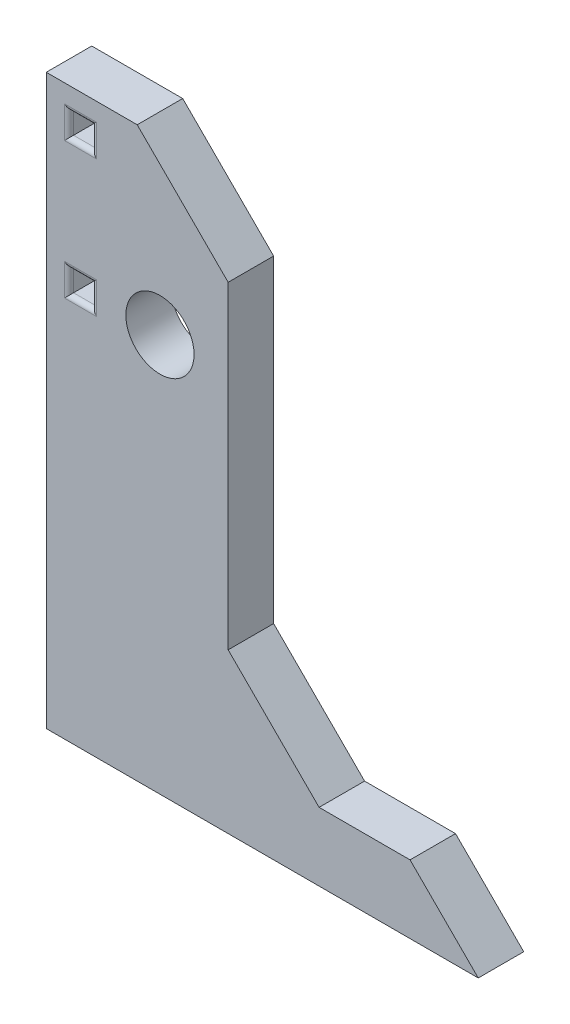
ISO-10303-21;
HEADER;
FILE_DESCRIPTION(('STEP AP214'),'2;1');
FILE_NAME('part.step','',(''),(''),'','','');
FILE_SCHEMA(('AUTOMOTIVE_DESIGN { 1 0 10303 214 1 1 1 1 }'));
ENDSEC;
DATA;
#1=APPLICATION_CONTEXT('core data for automotive mechanical design processes');
#2=APPLICATION_PROTOCOL_DEFINITION('international standard','automotive_design',2000,#1);
#3=PRODUCT_CONTEXT('',#1,'mechanical');
#4=PRODUCT('Part','Part','',(#3));
#5=PRODUCT_RELATED_PRODUCT_CATEGORY('part','',(#4));
#6=PRODUCT_DEFINITION_FORMATION('','',#4);
#7=PRODUCT_DEFINITION_CONTEXT('part definition',#1,'design');
#8=PRODUCT_DEFINITION('design','',#6,#7);
#9=PRODUCT_DEFINITION_SHAPE('','',#8);
#10=(LENGTH_UNIT() NAMED_UNIT(*) SI_UNIT(.MILLI.,.METRE.));
#11=(NAMED_UNIT(*) PLANE_ANGLE_UNIT() SI_UNIT($,.RADIAN.));
#12=(NAMED_UNIT(*) SI_UNIT($,.STERADIAN.) SOLID_ANGLE_UNIT());
#13=UNCERTAINTY_MEASURE_WITH_UNIT(LENGTH_MEASURE(1.E-05),#10,'distance_accuracy_value','');
#14=(GEOMETRIC_REPRESENTATION_CONTEXT(3) GLOBAL_UNCERTAINTY_ASSIGNED_CONTEXT((#13)) GLOBAL_UNIT_ASSIGNED_CONTEXT((#10,
#11,#12)) REPRESENTATION_CONTEXT('',''));
#15=CARTESIAN_POINT('',(0.,0.,0.));
#16=DIRECTION('',(0.,0.,1.));
#17=DIRECTION('',(1.,0.,0.));
#18=AXIS2_PLACEMENT_3D('',#15,#16,#17);
#19=CARTESIAN_POINT('',(-80.,0.,20.));
#20=DIRECTION('',(-1.,0.,0.));
#21=DIRECTION('',(0.,-1.,0.));
#22=AXIS2_PLACEMENT_3D('',#19,#20,#21);
#23=PLANE('',#22);
#24=DIRECTION('',(0.,1.,0.));
#25=VECTOR('',#24,1.);
#26=CARTESIAN_POINT('',(-80.,0.,0.));
#27=LINE('',#26,#25);
#28=CARTESIAN_POINT('',(-80.,-175.,0.));
#29=VERTEX_POINT('',#28);
#30=CARTESIAN_POINT('',(-80.,75.,0.));
#31=VERTEX_POINT('',#30);
#32=EDGE_CURVE('E240',#29,#31,#27,.T.);
#33=ORIENTED_EDGE('',*,*,#32,.F.);
#34=DIRECTION('',(0.,0.,-1.));
#35=VECTOR('',#34,1.);
#36=CARTESIAN_POINT('',(-80.,-175.,20.));
#37=LINE('',#36,#35);
#38=CARTESIAN_POINT('',(-80.,-175.,20.));
#39=VERTEX_POINT('',#38);
#40=EDGE_CURVE('E226',#39,#29,#37,.T.);
#41=ORIENTED_EDGE('',*,*,#40,.F.);
#42=DIRECTION('',(0.,1.,0.));
#43=VECTOR('',#42,1.);
#44=CARTESIAN_POINT('',(-80.,0.,20.));
#45=LINE('',#44,#43);
#46=CARTESIAN_POINT('',(-80.,75.,20.));
#47=VERTEX_POINT('',#46);
#48=EDGE_CURVE('E234',#39,#47,#45,.T.);
#49=ORIENTED_EDGE('',*,*,#48,.T.);
#50=DIRECTION('',(0.,0.,-1.));
#51=VECTOR('',#50,1.);
#52=CARTESIAN_POINT('',(-80.,75.,20.));
#53=LINE('',#52,#51);
#54=EDGE_CURVE('E242',#47,#31,#53,.T.);
#55=ORIENTED_EDGE('',*,*,#54,.T.);
#56=EDGE_LOOP('',(#33,#41,#49,#55));
#57=FACE_BOUND('',#56,.T.);
#58=ADVANCED_FACE('F47',(#57),#23,.T.);
#59=CARTESIAN_POINT('',(0.,-175.,20.));
#60=DIRECTION('',(0.,-1.,0.));
#61=DIRECTION('',(1.,0.,0.));
#62=AXIS2_PLACEMENT_3D('',#59,#60,#61);
#63=PLANE('',#62);
#64=DIRECTION('',(-1.,0.,0.));
#65=VECTOR('',#64,1.);
#66=CARTESIAN_POINT('',(0.,-175.,0.));
#67=LINE('',#66,#65);
#68=CARTESIAN_POINT('',(110.,-175.,0.));
#69=VERTEX_POINT('',#68);
#70=EDGE_CURVE('E269',#69,#29,#67,.T.);
#71=ORIENTED_EDGE('',*,*,#70,.F.);
#72=DIRECTION('',(0.,0.,-1.));
#73=VECTOR('',#72,1.);
#74=CARTESIAN_POINT('',(110.,-175.,20.));
#75=LINE('',#74,#73);
#76=CARTESIAN_POINT('',(110.,-175.,20.));
#77=VERTEX_POINT('',#76);
#78=EDGE_CURVE('E229',#69,#77,#75,.F.);
#79=ORIENTED_EDGE('',*,*,#78,.T.);
#80=DIRECTION('',(-1.,0.,0.));
#81=VECTOR('',#80,1.);
#82=CARTESIAN_POINT('',(0.,-175.,20.));
#83=LINE('',#82,#81);
#84=EDGE_CURVE('E222',#77,#39,#83,.T.);
#85=ORIENTED_EDGE('',*,*,#84,.T.);
#86=ORIENTED_EDGE('',*,*,#40,.T.);
#87=EDGE_LOOP('',(#71,#79,#85,#86));
#88=FACE_BOUND('',#87,.T.);
#89=ADVANCED_FACE('F225',(#88),#63,.T.);
#90=CARTESIAN_POINT('',(0.,-145.,20.));
#91=DIRECTION('',(0.,1.,0.));
#92=DIRECTION('',(0.,0.,1.));
#93=AXIS2_PLACEMENT_3D('',#90,#91,#92);
#94=PLANE('',#93);
#95=DIRECTION('',(1.,0.,0.));
#96=VECTOR('',#95,1.);
#97=CARTESIAN_POINT('',(0.,-145.,20.));
#98=LINE('',#97,#96);
#99=CARTESIAN_POINT('',(39.9999999999999,-145.,20.));
#100=VERTEX_POINT('',#99);
#101=CARTESIAN_POINT('',(79.9999999999993,-145.,20.));
#102=VERTEX_POINT('',#101);
#103=EDGE_CURVE('E233',#100,#102,#98,.T.);
#104=ORIENTED_EDGE('',*,*,#103,.T.);
#105=DIRECTION('',(0.,0.,-1.));
#106=VECTOR('',#105,1.);
#107=CARTESIAN_POINT('',(79.9999999999993,-145.,20.));
#108=LINE('',#107,#106);
#109=CARTESIAN_POINT('',(79.9999999999993,-145.,0.));
#110=VERTEX_POINT('',#109);
#111=EDGE_CURVE('E281',#102,#110,#108,.T.);
#112=ORIENTED_EDGE('',*,*,#111,.T.);
#113=DIRECTION('',(1.,0.,0.));
#114=VECTOR('',#113,1.);
#115=CARTESIAN_POINT('',(0.,-145.,0.));
#116=LINE('',#115,#114);
#117=CARTESIAN_POINT('',(39.9999999999999,-145.,0.));
#118=VERTEX_POINT('',#117);
#119=EDGE_CURVE('E271',#118,#110,#116,.T.);
#120=ORIENTED_EDGE('',*,*,#119,.F.);
#121=DIRECTION('',(0.,0.,1.));
#122=VECTOR('',#121,1.);
#123=CARTESIAN_POINT('',(39.9999999999999,-145.,20.));
#124=LINE('',#123,#122);
#125=EDGE_CURVE('E241',#118,#100,#124,.T.);
#126=ORIENTED_EDGE('',*,*,#125,.T.);
#127=EDGE_LOOP('',(#104,#112,#120,#126));
#128=FACE_BOUND('',#127,.T.);
#129=ADVANCED_FACE('F511',(#128),#94,.T.);
#130=CARTESIAN_POINT('',(0.,0.,20.));
#131=DIRECTION('',(1.,0.,0.));
#132=DIRECTION('',(0.,1.,0.));
#133=AXIS2_PLACEMENT_3D('',#130,#131,#132);
#134=PLANE('',#133);
#135=DIRECTION('',(0.,-1.,0.));
#136=VECTOR('',#135,1.);
#137=CARTESIAN_POINT('',(0.,0.,0.));
#138=LINE('',#137,#136);
#139=CARTESIAN_POINT('',(0.,34.9999999999999,0.));
#140=VERTEX_POINT('',#139);
#141=CARTESIAN_POINT('',(0.,-105.,0.));
#142=VERTEX_POINT('',#141);
#143=EDGE_CURVE('E274',#140,#142,#138,.T.);
#144=ORIENTED_EDGE('',*,*,#143,.F.);
#145=DIRECTION('',(0.,0.,1.));
#146=VECTOR('',#145,1.);
#147=CARTESIAN_POINT('',(0.,34.9999999999999,20.));
#148=LINE('',#147,#146);
#149=CARTESIAN_POINT('',(0.,34.9999999999999,20.));
#150=VERTEX_POINT('',#149);
#151=EDGE_CURVE('E299',#140,#150,#148,.T.);
#152=ORIENTED_EDGE('',*,*,#151,.T.);
#153=DIRECTION('',(0.,-1.,0.));
#154=VECTOR('',#153,1.);
#155=CARTESIAN_POINT('',(0.,0.,20.));
#156=LINE('',#155,#154);
#157=CARTESIAN_POINT('',(0.,-105.,20.));
#158=VERTEX_POINT('',#157);
#159=EDGE_CURVE('E259',#150,#158,#156,.T.);
#160=ORIENTED_EDGE('',*,*,#159,.T.);
#161=DIRECTION('',(0.,0.,-1.));
#162=VECTOR('',#161,1.);
#163=CARTESIAN_POINT('',(0.,-105.,0.));
#164=LINE('',#163,#162);
#165=EDGE_CURVE('E296',#158,#142,#164,.T.);
#166=ORIENTED_EDGE('',*,*,#165,.T.);
#167=EDGE_LOOP('',(#144,#152,#160,#166));
#168=FACE_BOUND('',#167,.T.);
#169=ADVANCED_FACE('F519',(#168),#134,.T.);
#170=CARTESIAN_POINT('',(-30.,0.,20.));
#171=DIRECTION('',(0.,0.,-1.));
#172=DIRECTION('',(-1.,0.,0.));
#173=AXIS2_PLACEMENT_3D('',#170,#171,#172);
#174=CYLINDRICAL_SURFACE('',#173,15.);
#175=CARTESIAN_POINT('',(-30.,0.,20.));
#176=DIRECTION('',(0.,0.,1.));
#177=DIRECTION('',(1.,0.,0.));
#178=AXIS2_PLACEMENT_3D('',#175,#176,#177);
#179=CIRCLE('',#178,15.);
#180=CARTESIAN_POINT('',(-15.,0.,20.));
#181=VERTEX_POINT('',#180);
#182=EDGE_CURVE('E248',#181,#181,#179,.T.);
#183=ORIENTED_EDGE('',*,*,#182,.T.);
#184=EDGE_LOOP('',(#183));
#185=FACE_BOUND('',#184,.T.);
#186=CARTESIAN_POINT('',(-30.,0.,0.));
#187=DIRECTION('',(0.,0.,1.));
#188=DIRECTION('',(1.,0.,0.));
#189=AXIS2_PLACEMENT_3D('',#186,#187,#188);
#190=CIRCLE('',#189,15.);
#191=CARTESIAN_POINT('',(-15.,0.,0.));
#192=VERTEX_POINT('',#191);
#193=EDGE_CURVE('E263',#192,#192,#190,.T.);
#194=ORIENTED_EDGE('',*,*,#193,.F.);
#195=EDGE_LOOP('',(#194));
#196=FACE_BOUND('',#195,.T.);
#197=ADVANCED_FACE('F515',(#185,#196),#174,.F.);
#198=CARTESIAN_POINT('',(0.,75.,20.));
#199=DIRECTION('',(0.,1.,0.));
#200=DIRECTION('',(0.,0.,1.));
#201=AXIS2_PLACEMENT_3D('',#198,#199,#200);
#202=PLANE('',#201);
#203=DIRECTION('',(1.,0.,0.));
#204=VECTOR('',#203,1.);
#205=CARTESIAN_POINT('',(0.,75.,20.));
#206=LINE('',#205,#204);
#207=CARTESIAN_POINT('',(-40.,75.,20.));
#208=VERTEX_POINT('',#207);
#209=EDGE_CURVE('E246',#47,#208,#206,.T.);
#210=ORIENTED_EDGE('',*,*,#209,.T.);
#211=DIRECTION('',(0.,0.,-1.));
#212=VECTOR('',#211,1.);
#213=CARTESIAN_POINT('',(-40.,75.,20.));
#214=LINE('',#213,#212);
#215=CARTESIAN_POINT('',(-40.,75.,0.));
#216=VERTEX_POINT('',#215);
#217=EDGE_CURVE('E293',#208,#216,#214,.T.);
#218=ORIENTED_EDGE('',*,*,#217,.T.);
#219=DIRECTION('',(1.,0.,0.));
#220=VECTOR('',#219,1.);
#221=CARTESIAN_POINT('',(0.,75.,0.));
#222=LINE('',#221,#220);
#223=EDGE_CURVE('E253',#31,#216,#222,.T.);
#224=ORIENTED_EDGE('',*,*,#223,.F.);
#225=ORIENTED_EDGE('',*,*,#54,.F.);
#226=EDGE_LOOP('',(#210,#218,#224,#225));
#227=FACE_BOUND('',#226,.T.);
#228=ADVANCED_FACE('F518',(#227),#202,.T.);
#229=CARTESIAN_POINT('',(0.,0.,20.));
#230=DIRECTION('',(0.,0.,1.));
#231=DIRECTION('',(1.,0.,0.));
#232=AXIS2_PLACEMENT_3D('',#229,#230,#231);
#233=PLANE('',#232);
#234=DIRECTION('',(1.,0.,0.));
#235=VECTOR('',#234,1.);
#236=CARTESIAN_POINT('',(-70.,53.,20.));
#237=LINE('',#236,#235);
#238=CARTESIAN_POINT('',(-58.,53.,20.));
#239=VERTEX_POINT('',#238);
#240=CARTESIAN_POINT('',(-72.,53.,20.));
#241=VERTEX_POINT('',#240);
#242=EDGE_CURVE('E325',#239,#241,#237,.F.);
#243=ORIENTED_EDGE('',*,*,#242,.T.);
#244=DIRECTION('',(0.,-1.,0.));
#245=VECTOR('',#244,1.);
#246=CARTESIAN_POINT('',(-72.,65.,20.));
#247=LINE('',#246,#245);
#248=CARTESIAN_POINT('',(-72.,67.,20.));
#249=VERTEX_POINT('',#248);
#250=EDGE_CURVE('E331',#241,#249,#247,.F.);
#251=ORIENTED_EDGE('',*,*,#250,.T.);
#252=DIRECTION('',(-1.,0.,0.));
#253=VECTOR('',#252,1.);
#254=CARTESIAN_POINT('',(-60.,67.,20.));
#255=LINE('',#254,#253);
#256=CARTESIAN_POINT('',(-58.,67.,20.));
#257=VERTEX_POINT('',#256);
#258=EDGE_CURVE('E329',#249,#257,#255,.F.);
#259=ORIENTED_EDGE('',*,*,#258,.T.);
#260=DIRECTION('',(0.,1.,0.));
#261=VECTOR('',#260,1.);
#262=CARTESIAN_POINT('',(-58.,55.,20.));
#263=LINE('',#262,#261);
#264=EDGE_CURVE('E327',#257,#239,#263,.F.);
#265=ORIENTED_EDGE('',*,*,#264,.T.);
#266=EDGE_LOOP('',(#243,#251,#259,#265));
#267=FACE_BOUND('',#266,.T.);
#268=DIRECTION('',(1.,0.,0.));
#269=VECTOR('',#268,1.);
#270=CARTESIAN_POINT('',(-70.,-7.,20.));
#271=LINE('',#270,#269);
#272=CARTESIAN_POINT('',(-58.,-7.,20.));
#273=VERTEX_POINT('',#272);
#274=CARTESIAN_POINT('',(-72.,-7.,20.));
#275=VERTEX_POINT('',#274);
#276=EDGE_CURVE('E318',#273,#275,#271,.F.);
#277=ORIENTED_EDGE('',*,*,#276,.T.);
#278=DIRECTION('',(0.,-1.,0.));
#279=VECTOR('',#278,1.);
#280=CARTESIAN_POINT('',(-72.,5.,20.));
#281=LINE('',#280,#279);
#282=CARTESIAN_POINT('',(-72.,7.,20.));
#283=VERTEX_POINT('',#282);
#284=EDGE_CURVE('E321',#275,#283,#281,.F.);
#285=ORIENTED_EDGE('',*,*,#284,.T.);
#286=DIRECTION('',(-1.,0.,0.));
#287=VECTOR('',#286,1.);
#288=CARTESIAN_POINT('',(-60.,7.,20.));
#289=LINE('',#288,#287);
#290=CARTESIAN_POINT('',(-58.,7.,20.));
#291=VERTEX_POINT('',#290);
#292=EDGE_CURVE('E315',#283,#291,#289,.F.);
#293=ORIENTED_EDGE('',*,*,#292,.T.);
#294=DIRECTION('',(0.,1.,0.));
#295=VECTOR('',#294,1.);
#296=CARTESIAN_POINT('',(-58.,-5.,20.));
#297=LINE('',#296,#295);
#298=EDGE_CURVE('E312',#291,#273,#297,.F.);
#299=ORIENTED_EDGE('',*,*,#298,.T.);
#300=EDGE_LOOP('',(#277,#285,#293,#299));
#301=FACE_BOUND('',#300,.T.);
#302=ORIENTED_EDGE('',*,*,#182,.F.);
#303=EDGE_LOOP('',(#302));
#304=FACE_BOUND('',#303,.T.);
#305=ORIENTED_EDGE('',*,*,#84,.F.);
#306=DIRECTION('',(0.707106781186552,-0.707106781186543,0.));
#307=VECTOR('',#306,1.);
#308=CARTESIAN_POINT('',(-32.5000000000008,-32.5000000000012,20.));
#309=LINE('',#308,#307);
#310=EDGE_CURVE('E291',#77,#102,#309,.F.);
#311=ORIENTED_EDGE('',*,*,#310,.T.);
#312=ORIENTED_EDGE('',*,*,#103,.F.);
#313=DIRECTION('',(0.707106781186544,-0.707106781186551,0.));
#314=VECTOR('',#313,1.);
#315=CARTESIAN_POINT('',(0.,-105.,20.));
#316=LINE('',#315,#314);
#317=EDGE_CURVE('E304',#100,#158,#316,.F.);
#318=ORIENTED_EDGE('',*,*,#317,.T.);
#319=ORIENTED_EDGE('',*,*,#159,.F.);
#320=DIRECTION('',(0.707106781186546,-0.707106781186549,0.));
#321=VECTOR('',#320,1.);
#322=CARTESIAN_POINT('',(17.5,17.4999999999999,20.));
#323=LINE('',#322,#321);
#324=EDGE_CURVE('E289',#150,#208,#323,.F.);
#325=ORIENTED_EDGE('',*,*,#324,.T.);
#326=ORIENTED_EDGE('',*,*,#209,.F.);
#327=ORIENTED_EDGE('',*,*,#48,.F.);
#328=EDGE_LOOP('',(#305,#311,#312,#318,#319,#325,#326,#327));
#329=FACE_BOUND('',#328,.T.);
#330=ADVANCED_FACE('F244',(#267,#301,#304,#329),#233,.T.);
#331=CARTESIAN_POINT('',(0.,0.,0.));
#332=DIRECTION('',(0.,0.,1.));
#333=DIRECTION('',(1.,0.,0.));
#334=AXIS2_PLACEMENT_3D('',#331,#332,#333);
#335=PLANE('',#334);
#336=DIRECTION('',(-1.,0.,0.));
#337=VECTOR('',#336,1.);
#338=CARTESIAN_POINT('',(0.,67.,0.));
#339=LINE('',#338,#337);
#340=CARTESIAN_POINT('',(-58.,67.,0.));
#341=VERTEX_POINT('',#340);
#342=CARTESIAN_POINT('',(-72.,67.,0.));
#343=VERTEX_POINT('',#342);
#344=EDGE_CURVE('E56',#341,#343,#339,.T.);
#345=ORIENTED_EDGE('',*,*,#344,.T.);
#346=DIRECTION('',(0.,-1.,0.));
#347=VECTOR('',#346,1.);
#348=CARTESIAN_POINT('',(-72.,0.,0.));
#349=LINE('',#348,#347);
#350=CARTESIAN_POINT('',(-72.,53.,0.));
#351=VERTEX_POINT('',#350);
#352=EDGE_CURVE('E11',#343,#351,#349,.T.);
#353=ORIENTED_EDGE('',*,*,#352,.T.);
#354=DIRECTION('',(1.,0.,0.));
#355=VECTOR('',#354,1.);
#356=CARTESIAN_POINT('',(0.,53.,0.));
#357=LINE('',#356,#355);
#358=CARTESIAN_POINT('',(-58.,53.,0.));
#359=VERTEX_POINT('',#358);
#360=EDGE_CURVE('E385',#351,#359,#357,.T.);
#361=ORIENTED_EDGE('',*,*,#360,.T.);
#362=DIRECTION('',(0.,1.,0.));
#363=VECTOR('',#362,1.);
#364=CARTESIAN_POINT('',(-58.,0.,0.));
#365=LINE('',#364,#363);
#366=EDGE_CURVE('E67',#359,#341,#365,.T.);
#367=ORIENTED_EDGE('',*,*,#366,.T.);
#368=EDGE_LOOP('',(#345,#353,#361,#367));
#369=FACE_BOUND('',#368,.T.);
#370=DIRECTION('',(0.,1.,0.));
#371=VECTOR('',#370,1.);
#372=CARTESIAN_POINT('',(-58.,0.,0.));
#373=LINE('',#372,#371);
#374=CARTESIAN_POINT('',(-58.,-7.,0.));
#375=VERTEX_POINT('',#374);
#376=CARTESIAN_POINT('',(-58.,7.,0.));
#377=VERTEX_POINT('',#376);
#378=EDGE_CURVE('E375',#375,#377,#373,.T.);
#379=ORIENTED_EDGE('',*,*,#378,.T.);
#380=DIRECTION('',(-1.,0.,0.));
#381=VECTOR('',#380,1.);
#382=CARTESIAN_POINT('',(0.,7.,0.));
#383=LINE('',#382,#381);
#384=CARTESIAN_POINT('',(-72.,7.,0.));
#385=VERTEX_POINT('',#384);
#386=EDGE_CURVE('E382',#377,#385,#383,.T.);
#387=ORIENTED_EDGE('',*,*,#386,.T.);
#388=DIRECTION('',(0.,-1.,0.));
#389=VECTOR('',#388,1.);
#390=CARTESIAN_POINT('',(-72.,0.,0.));
#391=LINE('',#390,#389);
#392=CARTESIAN_POINT('',(-72.,-7.,0.));
#393=VERTEX_POINT('',#392);
#394=EDGE_CURVE('E378',#385,#393,#391,.T.);
#395=ORIENTED_EDGE('',*,*,#394,.T.);
#396=DIRECTION('',(1.,0.,0.));
#397=VECTOR('',#396,1.);
#398=CARTESIAN_POINT('',(0.,-7.,0.));
#399=LINE('',#398,#397);
#400=EDGE_CURVE('E372',#393,#375,#399,.T.);
#401=ORIENTED_EDGE('',*,*,#400,.T.);
#402=EDGE_LOOP('',(#379,#387,#395,#401));
#403=FACE_BOUND('',#402,.T.);
#404=ORIENTED_EDGE('',*,*,#193,.T.);
#405=EDGE_LOOP('',(#404));
#406=FACE_BOUND('',#405,.T.);
#407=ORIENTED_EDGE('',*,*,#119,.T.);
#408=DIRECTION('',(-0.707106781186552,0.707106781186543,0.));
#409=VECTOR('',#408,1.);
#410=CARTESIAN_POINT('',(79.9999999999993,-145.,0.));
#411=LINE('',#410,#409);
#412=EDGE_CURVE('E286',#110,#69,#411,.F.);
#413=ORIENTED_EDGE('',*,*,#412,.T.);
#414=ORIENTED_EDGE('',*,*,#70,.T.);
#415=ORIENTED_EDGE('',*,*,#32,.T.);
#416=ORIENTED_EDGE('',*,*,#223,.T.);
#417=DIRECTION('',(-0.707106781186546,0.707106781186549,0.));
#418=VECTOR('',#417,1.);
#419=CARTESIAN_POINT('',(-40.,75.,0.));
#420=LINE('',#419,#418);
#421=EDGE_CURVE('E284',#216,#140,#420,.F.);
#422=ORIENTED_EDGE('',*,*,#421,.T.);
#423=ORIENTED_EDGE('',*,*,#143,.T.);
#424=DIRECTION('',(-0.707106781186544,0.707106781186551,0.));
#425=VECTOR('',#424,1.);
#426=CARTESIAN_POINT('',(-52.4999999999999,-52.4999999999994,0.));
#427=LINE('',#426,#425);
#428=EDGE_CURVE('E301',#142,#118,#427,.F.);
#429=ORIENTED_EDGE('',*,*,#428,.T.);
#430=EDGE_LOOP('',(#407,#413,#414,#415,#416,#422,#423,#429));
#431=FACE_BOUND('',#430,.T.);
#432=ADVANCED_FACE('F503',(#369,#403,#406,#431),#335,.F.);
#433=CARTESIAN_POINT('',(-70.,5.,0.));
#434=DIRECTION('',(-1.,0.,0.));
#435=DIRECTION('',(0.,0.,1.));
#436=AXIS2_PLACEMENT_3D('',#433,#434,#435);
#437=PLANE('',#436);
#438=DIRECTION('',(0.,0.,1.));
#439=VECTOR('',#438,1.);
#440=CARTESIAN_POINT('',(-70.,5.,0.));
#441=LINE('',#440,#439);
#442=CARTESIAN_POINT('',(-70.,5.,2.));
#443=VERTEX_POINT('',#442);
#444=CARTESIAN_POINT('',(-70.,5.,18.));
#445=VERTEX_POINT('',#444);
#446=EDGE_CURVE('E400',#443,#445,#441,.T.);
#447=ORIENTED_EDGE('',*,*,#446,.T.);
#448=DIRECTION('',(0.,-1.,0.));
#449=VECTOR('',#448,1.);
#450=CARTESIAN_POINT('',(-70.,-5.,18.));
#451=LINE('',#450,#449);
#452=CARTESIAN_POINT('',(-70.,-5.,18.));
#453=VERTEX_POINT('',#452);
#454=EDGE_CURVE('E350',#445,#453,#451,.T.);
#455=ORIENTED_EDGE('',*,*,#454,.T.);
#456=DIRECTION('',(0.,0.,1.));
#457=VECTOR('',#456,1.);
#458=CARTESIAN_POINT('',(-70.,-5.,0.));
#459=LINE('',#458,#457);
#460=CARTESIAN_POINT('',(-70.,-5.,2.));
#461=VERTEX_POINT('',#460);
#462=EDGE_CURVE('E462',#461,#453,#459,.T.);
#463=ORIENTED_EDGE('',*,*,#462,.F.);
#464=DIRECTION('',(0.,-1.,0.));
#465=VECTOR('',#464,1.);
#466=CARTESIAN_POINT('',(-70.,5.,2.));
#467=LINE('',#466,#465);
#468=EDGE_CURVE('E346',#461,#443,#467,.F.);
#469=ORIENTED_EDGE('',*,*,#468,.T.);
#470=EDGE_LOOP('',(#447,#455,#463,#469));
#471=FACE_BOUND('',#470,.T.);
#472=ADVANCED_FACE('F475',(#471),#437,.F.);
#473=CARTESIAN_POINT('',(-70.,5.,0.));
#474=DIRECTION('',(0.,1.,0.));
#475=DIRECTION('',(0.,0.,1.));
#476=AXIS2_PLACEMENT_3D('',#473,#474,#475);
#477=PLANE('',#476);
#478=DIRECTION('',(0.,0.,1.));
#479=VECTOR('',#478,1.);
#480=CARTESIAN_POINT('',(-60.,5.,0.));
#481=LINE('',#480,#479);
#482=CARTESIAN_POINT('',(-60.,5.,2.));
#483=VERTEX_POINT('',#482);
#484=CARTESIAN_POINT('',(-60.,5.,18.));
#485=VERTEX_POINT('',#484);
#486=EDGE_CURVE('E455',#483,#485,#481,.T.);
#487=ORIENTED_EDGE('',*,*,#486,.T.);
#488=DIRECTION('',(-1.,0.,0.));
#489=VECTOR('',#488,1.);
#490=CARTESIAN_POINT('',(-70.,5.,18.));
#491=LINE('',#490,#489);
#492=EDGE_CURVE('E363',#485,#445,#491,.T.);
#493=ORIENTED_EDGE('',*,*,#492,.T.);
#494=ORIENTED_EDGE('',*,*,#446,.F.);
#495=DIRECTION('',(-1.,0.,0.));
#496=VECTOR('',#495,1.);
#497=CARTESIAN_POINT('',(-70.,5.,2.));
#498=LINE('',#497,#496);
#499=EDGE_CURVE('E360',#443,#483,#498,.F.);
#500=ORIENTED_EDGE('',*,*,#499,.T.);
#501=EDGE_LOOP('',(#487,#493,#494,#500));
#502=FACE_BOUND('',#501,.T.);
#503=ADVANCED_FACE('F495',(#502),#477,.F.);
#504=CARTESIAN_POINT('',(-60.,5.,0.));
#505=DIRECTION('',(1.,0.,0.));
#506=DIRECTION('',(0.,0.,-1.));
#507=AXIS2_PLACEMENT_3D('',#504,#505,#506);
#508=PLANE('',#507);
#509=DIRECTION('',(0.,0.,1.));
#510=VECTOR('',#509,1.);
#511=CARTESIAN_POINT('',(-60.,-5.,0.));
#512=LINE('',#511,#510);
#513=CARTESIAN_POINT('',(-60.,-5.,2.));
#514=VERTEX_POINT('',#513);
#515=CARTESIAN_POINT('',(-60.,-5.,18.));
#516=VERTEX_POINT('',#515);
#517=EDGE_CURVE('E452',#514,#516,#512,.T.);
#518=ORIENTED_EDGE('',*,*,#517,.T.);
#519=DIRECTION('',(0.,1.,0.));
#520=VECTOR('',#519,1.);
#521=CARTESIAN_POINT('',(-60.,5.,18.));
#522=LINE('',#521,#520);
#523=EDGE_CURVE('E369',#516,#485,#522,.T.);
#524=ORIENTED_EDGE('',*,*,#523,.T.);
#525=ORIENTED_EDGE('',*,*,#486,.F.);
#526=DIRECTION('',(0.,1.,0.));
#527=VECTOR('',#526,1.);
#528=CARTESIAN_POINT('',(-60.,5.,2.));
#529=LINE('',#528,#527);
#530=EDGE_CURVE('E366',#483,#514,#529,.F.);
#531=ORIENTED_EDGE('',*,*,#530,.T.);
#532=EDGE_LOOP('',(#518,#524,#525,#531));
#533=FACE_BOUND('',#532,.T.);
#534=ADVANCED_FACE('F451',(#533),#508,.F.);
#535=CARTESIAN_POINT('',(-70.,-5.,0.));
#536=DIRECTION('',(0.,-1.,0.));
#537=DIRECTION('',(0.,0.,-1.));
#538=AXIS2_PLACEMENT_3D('',#535,#536,#537);
#539=PLANE('',#538);
#540=ORIENTED_EDGE('',*,*,#462,.T.);
#541=DIRECTION('',(1.,0.,0.));
#542=VECTOR('',#541,1.);
#543=CARTESIAN_POINT('',(-60.,-5.,18.));
#544=LINE('',#543,#542);
#545=EDGE_CURVE('E357',#453,#516,#544,.T.);
#546=ORIENTED_EDGE('',*,*,#545,.T.);
#547=ORIENTED_EDGE('',*,*,#517,.F.);
#548=DIRECTION('',(1.,0.,0.));
#549=VECTOR('',#548,1.);
#550=CARTESIAN_POINT('',(-70.,-5.,2.));
#551=LINE('',#550,#549);
#552=EDGE_CURVE('E354',#514,#461,#551,.F.);
#553=ORIENTED_EDGE('',*,*,#552,.T.);
#554=EDGE_LOOP('',(#540,#546,#547,#553));
#555=FACE_BOUND('',#554,.T.);
#556=ADVANCED_FACE('F458',(#555),#539,.F.);
#557=CARTESIAN_POINT('',(-70.,65.,0.));
#558=DIRECTION('',(-1.,0.,0.));
#559=DIRECTION('',(0.,0.,1.));
#560=AXIS2_PLACEMENT_3D('',#557,#558,#559);
#561=PLANE('',#560);
#562=DIRECTION('',(0.,0.,1.));
#563=VECTOR('',#562,1.);
#564=CARTESIAN_POINT('',(-70.,65.,0.));
#565=LINE('',#564,#563);
#566=CARTESIAN_POINT('',(-70.,65.,2.));
#567=VERTEX_POINT('',#566);
#568=CARTESIAN_POINT('',(-70.,65.,18.));
#569=VERTEX_POINT('',#568);
#570=EDGE_CURVE('E267',#567,#569,#565,.T.);
#571=ORIENTED_EDGE('',*,*,#570,.T.);
#572=DIRECTION('',(0.,-1.,0.));
#573=VECTOR('',#572,1.);
#574=CARTESIAN_POINT('',(-70.,55.,18.));
#575=LINE('',#574,#573);
#576=CARTESIAN_POINT('',(-70.,55.,18.));
#577=VERTEX_POINT('',#576);
#578=EDGE_CURVE('E309',#569,#577,#575,.T.);
#579=ORIENTED_EDGE('',*,*,#578,.T.);
#580=DIRECTION('',(0.,0.,1.));
#581=VECTOR('',#580,1.);
#582=CARTESIAN_POINT('',(-70.,55.,0.));
#583=LINE('',#582,#581);
#584=CARTESIAN_POINT('',(-70.,55.,2.));
#585=VERTEX_POINT('',#584);
#586=EDGE_CURVE('E466',#585,#577,#583,.T.);
#587=ORIENTED_EDGE('',*,*,#586,.F.);
#588=DIRECTION('',(0.,-1.,0.));
#589=VECTOR('',#588,1.);
#590=CARTESIAN_POINT('',(-70.,65.,2.));
#591=LINE('',#590,#589);
#592=EDGE_CURVE('E306',#585,#567,#591,.F.);
#593=ORIENTED_EDGE('',*,*,#592,.T.);
#594=EDGE_LOOP('',(#571,#579,#587,#593));
#595=FACE_BOUND('',#594,.T.);
#596=ADVANCED_FACE('F679',(#595),#561,.F.);
#597=CARTESIAN_POINT('',(-70.,65.,0.));
#598=DIRECTION('',(0.,1.,0.));
#599=DIRECTION('',(0.,0.,1.));
#600=AXIS2_PLACEMENT_3D('',#597,#598,#599);
#601=PLANE('',#600);
#602=DIRECTION('',(0.,0.,1.));
#603=VECTOR('',#602,1.);
#604=CARTESIAN_POINT('',(-60.,65.,0.));
#605=LINE('',#604,#603);
#606=CARTESIAN_POINT('',(-60.,65.,2.));
#607=VERTEX_POINT('',#606);
#608=CARTESIAN_POINT('',(-60.,65.,18.));
#609=VERTEX_POINT('',#608);
#610=EDGE_CURVE('E993',#607,#609,#605,.T.);
#611=ORIENTED_EDGE('',*,*,#610,.T.);
#612=DIRECTION('',(-1.,0.,0.));
#613=VECTOR('',#612,1.);
#614=CARTESIAN_POINT('',(-70.,65.,18.));
#615=LINE('',#614,#613);
#616=EDGE_CURVE('E336',#609,#569,#615,.T.);
#617=ORIENTED_EDGE('',*,*,#616,.T.);
#618=ORIENTED_EDGE('',*,*,#570,.F.);
#619=DIRECTION('',(-1.,0.,0.));
#620=VECTOR('',#619,1.);
#621=CARTESIAN_POINT('',(-70.,65.,2.));
#622=LINE('',#621,#620);
#623=EDGE_CURVE('E334',#567,#607,#622,.F.);
#624=ORIENTED_EDGE('',*,*,#623,.T.);
#625=EDGE_LOOP('',(#611,#617,#618,#624));
#626=FACE_BOUND('',#625,.T.);
#627=ADVANCED_FACE('F671',(#626),#601,.F.);
#628=CARTESIAN_POINT('',(-60.,65.,0.));
#629=DIRECTION('',(1.,0.,0.));
#630=DIRECTION('',(0.,0.,-1.));
#631=AXIS2_PLACEMENT_3D('',#628,#629,#630);
#632=PLANE('',#631);
#633=DIRECTION('',(0.,0.,1.));
#634=VECTOR('',#633,1.);
#635=CARTESIAN_POINT('',(-60.,55.,0.));
#636=LINE('',#635,#634);
#637=CARTESIAN_POINT('',(-60.,55.,2.));
#638=VERTEX_POINT('',#637);
#639=CARTESIAN_POINT('',(-60.,55.,18.));
#640=VERTEX_POINT('',#639);
#641=EDGE_CURVE('E992',#638,#640,#636,.T.);
#642=ORIENTED_EDGE('',*,*,#641,.T.);
#643=DIRECTION('',(0.,1.,0.));
#644=VECTOR('',#643,1.);
#645=CARTESIAN_POINT('',(-60.,65.,18.));
#646=LINE('',#645,#644);
#647=EDGE_CURVE('E340',#640,#609,#646,.T.);
#648=ORIENTED_EDGE('',*,*,#647,.T.);
#649=ORIENTED_EDGE('',*,*,#610,.F.);
#650=DIRECTION('',(0.,1.,0.));
#651=VECTOR('',#650,1.);
#652=CARTESIAN_POINT('',(-60.,65.,2.));
#653=LINE('',#652,#651);
#654=EDGE_CURVE('E338',#607,#638,#653,.F.);
#655=ORIENTED_EDGE('',*,*,#654,.T.);
#656=EDGE_LOOP('',(#642,#648,#649,#655));
#657=FACE_BOUND('',#656,.T.);
#658=ADVANCED_FACE('F663',(#657),#632,.F.);
#659=CARTESIAN_POINT('',(-70.,55.,0.));
#660=DIRECTION('',(0.,-1.,0.));
#661=DIRECTION('',(0.,0.,-1.));
#662=AXIS2_PLACEMENT_3D('',#659,#660,#661);
#663=PLANE('',#662);
#664=ORIENTED_EDGE('',*,*,#586,.T.);
#665=DIRECTION('',(1.,0.,0.));
#666=VECTOR('',#665,1.);
#667=CARTESIAN_POINT('',(-60.,55.,18.));
#668=LINE('',#667,#666);
#669=EDGE_CURVE('E344',#577,#640,#668,.T.);
#670=ORIENTED_EDGE('',*,*,#669,.T.);
#671=ORIENTED_EDGE('',*,*,#641,.F.);
#672=DIRECTION('',(1.,0.,0.));
#673=VECTOR('',#672,1.);
#674=CARTESIAN_POINT('',(-70.,55.,2.));
#675=LINE('',#674,#673);
#676=EDGE_CURVE('E342',#638,#585,#675,.F.);
#677=ORIENTED_EDGE('',*,*,#676,.T.);
#678=EDGE_LOOP('',(#664,#670,#671,#677));
#679=FACE_BOUND('',#678,.T.);
#680=ADVANCED_FACE('F529',(#679),#663,.F.);
#681=CARTESIAN_POINT('',(79.9999999999993,-145.,20.));
#682=DIRECTION('',(-0.707106781186543,-0.707106781186552,0.));
#683=DIRECTION('',(0.,0.,-1.));
#684=AXIS2_PLACEMENT_3D('',#681,#682,#683);
#685=PLANE('',#684);
#686=ORIENTED_EDGE('',*,*,#310,.F.);
#687=ORIENTED_EDGE('',*,*,#78,.F.);
#688=ORIENTED_EDGE('',*,*,#412,.F.);
#689=ORIENTED_EDGE('',*,*,#111,.F.);
#690=EDGE_LOOP('',(#686,#687,#688,#689));
#691=FACE_BOUND('',#690,.T.);
#692=ADVANCED_FACE('F522',(#691),#685,.F.);
#693=CARTESIAN_POINT('',(-40.,75.,20.));
#694=DIRECTION('',(-0.707106781186549,-0.707106781186546,0.));
#695=DIRECTION('',(0.,0.,-1.));
#696=AXIS2_PLACEMENT_3D('',#693,#694,#695);
#697=PLANE('',#696);
#698=ORIENTED_EDGE('',*,*,#324,.F.);
#699=ORIENTED_EDGE('',*,*,#151,.F.);
#700=ORIENTED_EDGE('',*,*,#421,.F.);
#701=ORIENTED_EDGE('',*,*,#217,.F.);
#702=EDGE_LOOP('',(#698,#699,#700,#701));
#703=FACE_BOUND('',#702,.T.);
#704=ADVANCED_FACE('F528',(#703),#697,.F.);
#705=CARTESIAN_POINT('',(0.,-105.,20.));
#706=DIRECTION('',(0.707106781186551,0.707106781186544,0.));
#707=DIRECTION('',(0.,0.,1.));
#708=AXIS2_PLACEMENT_3D('',#705,#706,#707);
#709=PLANE('',#708);
#710=ORIENTED_EDGE('',*,*,#317,.F.);
#711=ORIENTED_EDGE('',*,*,#125,.F.);
#712=ORIENTED_EDGE('',*,*,#428,.F.);
#713=ORIENTED_EDGE('',*,*,#165,.F.);
#714=EDGE_LOOP('',(#710,#711,#712,#713));
#715=FACE_BOUND('',#714,.T.);
#716=ADVANCED_FACE('F536',(#715),#709,.T.);
#717=CARTESIAN_POINT('',(-58.,65.,18.));
#718=DIRECTION('',(0.,-1.,0.));
#719=DIRECTION('',(0.,0.,-1.));
#720=AXIS2_PLACEMENT_3D('',#717,#718,#719);
#721=CYLINDRICAL_SURFACE('',#720,2.);
#722=CARTESIAN_POINT('',(-58.,53.,18.));
#723=DIRECTION('',(-0.707106781186547,-0.707106781186547,0.));
#724=DIRECTION('',(0.707106781186547,-0.707106781186547,0.));
#725=AXIS2_PLACEMENT_3D('',#722,#723,#724);
#726=ELLIPSE('',#725,2.82842712474619,2.);
#727=EDGE_CURVE('E394',#239,#640,#726,.T.);
#728=ORIENTED_EDGE('',*,*,#727,.F.);
#729=ORIENTED_EDGE('',*,*,#264,.F.);
#730=CARTESIAN_POINT('',(-58.,67.,18.));
#731=DIRECTION('',(0.707106781186547,-0.707106781186547,0.));
#732=DIRECTION('',(0.707106781186547,0.707106781186547,0.));
#733=AXIS2_PLACEMENT_3D('',#730,#731,#732);
#734=ELLIPSE('',#733,2.82842712474619,2.);
#735=EDGE_CURVE('E397',#609,#257,#734,.F.);
#736=ORIENTED_EDGE('',*,*,#735,.F.);
#737=ORIENTED_EDGE('',*,*,#647,.F.);
#738=EDGE_LOOP('',(#728,#729,#736,#737));
#739=FACE_BOUND('',#738,.T.);
#740=ADVANCED_FACE('F542',(#739),#721,.T.);
#741=CARTESIAN_POINT('',(-70.,67.,18.));
#742=DIRECTION('',(1.,0.,0.));
#743=DIRECTION('',(0.,0.,-1.));
#744=AXIS2_PLACEMENT_3D('',#741,#742,#743);
#745=CYLINDRICAL_SURFACE('',#744,2.);
#746=ORIENTED_EDGE('',*,*,#735,.T.);
#747=ORIENTED_EDGE('',*,*,#258,.F.);
#748=CARTESIAN_POINT('',(-72.,67.,18.));
#749=DIRECTION('',(0.707106781186547,0.707106781186547,0.));
#750=DIRECTION('',(-0.707106781186547,0.707106781186547,0.));
#751=AXIS2_PLACEMENT_3D('',#748,#749,#750);
#752=ELLIPSE('',#751,2.82842712474619,2.);
#753=EDGE_CURVE('E391',#569,#249,#752,.F.);
#754=ORIENTED_EDGE('',*,*,#753,.F.);
#755=ORIENTED_EDGE('',*,*,#616,.F.);
#756=EDGE_LOOP('',(#746,#747,#754,#755));
#757=FACE_BOUND('',#756,.T.);
#758=ADVANCED_FACE('F551',(#757),#745,.T.);
#759=CARTESIAN_POINT('',(-70.,53.,18.));
#760=DIRECTION('',(-1.,0.,0.));
#761=DIRECTION('',(0.,0.,1.));
#762=AXIS2_PLACEMENT_3D('',#759,#760,#761);
#763=CYLINDRICAL_SURFACE('',#762,2.);
#764=ORIENTED_EDGE('',*,*,#727,.T.);
#765=ORIENTED_EDGE('',*,*,#669,.F.);
#766=CARTESIAN_POINT('',(-72.,53.,18.));
#767=DIRECTION('',(-0.707106781186547,0.707106781186547,0.));
#768=DIRECTION('',(0.707106781186547,0.707106781186547,0.));
#769=AXIS2_PLACEMENT_3D('',#766,#767,#768);
#770=ELLIPSE('',#769,2.82842712474619,2.);
#771=EDGE_CURVE('E389',#241,#577,#770,.T.);
#772=ORIENTED_EDGE('',*,*,#771,.F.);
#773=ORIENTED_EDGE('',*,*,#242,.F.);
#774=EDGE_LOOP('',(#764,#765,#772,#773));
#775=FACE_BOUND('',#774,.T.);
#776=ADVANCED_FACE('F547',(#775),#763,.T.);
#777=CARTESIAN_POINT('',(-72.,65.,18.));
#778=DIRECTION('',(0.,1.,0.));
#779=DIRECTION('',(0.,0.,1.));
#780=AXIS2_PLACEMENT_3D('',#777,#778,#779);
#781=CYLINDRICAL_SURFACE('',#780,2.);
#782=ORIENTED_EDGE('',*,*,#753,.T.);
#783=ORIENTED_EDGE('',*,*,#250,.F.);
#784=ORIENTED_EDGE('',*,*,#771,.T.);
#785=ORIENTED_EDGE('',*,*,#578,.F.);
#786=EDGE_LOOP('',(#782,#783,#784,#785));
#787=FACE_BOUND('',#786,.T.);
#788=ADVANCED_FACE('F544',(#787),#781,.T.);
#789=CARTESIAN_POINT('',(-58.,5.,18.));
#790=DIRECTION('',(0.,-1.,0.));
#791=DIRECTION('',(0.,0.,-1.));
#792=AXIS2_PLACEMENT_3D('',#789,#790,#791);
#793=CYLINDRICAL_SURFACE('',#792,2.);
#794=CARTESIAN_POINT('',(-58.,-7.,18.));
#795=DIRECTION('',(-0.707106781186547,-0.707106781186547,0.));
#796=DIRECTION('',(-0.707106781186547,0.707106781186547,0.));
#797=AXIS2_PLACEMENT_3D('',#794,#795,#796);
#798=ELLIPSE('',#797,2.82842712474619,2.);
#799=EDGE_CURVE('E408',#273,#516,#798,.T.);
#800=ORIENTED_EDGE('',*,*,#799,.F.);
#801=ORIENTED_EDGE('',*,*,#298,.F.);
#802=CARTESIAN_POINT('',(-58.,7.,18.));
#803=DIRECTION('',(0.707106781186547,-0.707106781186547,0.));
#804=DIRECTION('',(0.707106781186547,0.707106781186547,0.));
#805=AXIS2_PLACEMENT_3D('',#802,#803,#804);
#806=ELLIPSE('',#805,2.82842712474619,2.);
#807=EDGE_CURVE('E392',#485,#291,#806,.F.);
#808=ORIENTED_EDGE('',*,*,#807,.F.);
#809=ORIENTED_EDGE('',*,*,#523,.F.);
#810=EDGE_LOOP('',(#800,#801,#808,#809));
#811=FACE_BOUND('',#810,.T.);
#812=ADVANCED_FACE('F493',(#811),#793,.T.);
#813=CARTESIAN_POINT('',(-70.,7.,18.));
#814=DIRECTION('',(1.,0.,0.));
#815=DIRECTION('',(0.,0.,-1.));
#816=AXIS2_PLACEMENT_3D('',#813,#814,#815);
#817=CYLINDRICAL_SURFACE('',#816,2.);
#818=ORIENTED_EDGE('',*,*,#807,.T.);
#819=ORIENTED_EDGE('',*,*,#292,.F.);
#820=CARTESIAN_POINT('',(-72.,7.,18.));
#821=DIRECTION('',(0.707106781186547,0.707106781186547,0.));
#822=DIRECTION('',(-0.707106781186547,0.707106781186547,0.));
#823=AXIS2_PLACEMENT_3D('',#820,#821,#822);
#824=ELLIPSE('',#823,2.82842712474619,2.);
#825=EDGE_CURVE('E404',#445,#283,#824,.F.);
#826=ORIENTED_EDGE('',*,*,#825,.F.);
#827=ORIENTED_EDGE('',*,*,#492,.F.);
#828=EDGE_LOOP('',(#818,#819,#826,#827));
#829=FACE_BOUND('',#828,.T.);
#830=ADVANCED_FACE('F482',(#829),#817,.T.);
#831=CARTESIAN_POINT('',(-70.,-7.,18.));
#832=DIRECTION('',(-1.,0.,0.));
#833=DIRECTION('',(0.,0.,1.));
#834=AXIS2_PLACEMENT_3D('',#831,#832,#833);
#835=CYLINDRICAL_SURFACE('',#834,2.);
#836=ORIENTED_EDGE('',*,*,#799,.T.);
#837=ORIENTED_EDGE('',*,*,#545,.F.);
#838=CARTESIAN_POINT('',(-72.,-7.,18.));
#839=DIRECTION('',(-0.707106781186547,0.707106781186547,0.));
#840=DIRECTION('',(0.707106781186547,0.707106781186547,0.));
#841=AXIS2_PLACEMENT_3D('',#838,#839,#840);
#842=ELLIPSE('',#841,2.82842712474619,2.);
#843=EDGE_CURVE('E401',#275,#453,#842,.T.);
#844=ORIENTED_EDGE('',*,*,#843,.F.);
#845=ORIENTED_EDGE('',*,*,#276,.F.);
#846=EDGE_LOOP('',(#836,#837,#844,#845));
#847=FACE_BOUND('',#846,.T.);
#848=ADVANCED_FACE('F489',(#847),#835,.T.);
#849=CARTESIAN_POINT('',(-72.,5.,18.));
#850=DIRECTION('',(0.,1.,0.));
#851=DIRECTION('',(0.,0.,1.));
#852=AXIS2_PLACEMENT_3D('',#849,#850,#851);
#853=CYLINDRICAL_SURFACE('',#852,2.);
#854=ORIENTED_EDGE('',*,*,#825,.T.);
#855=ORIENTED_EDGE('',*,*,#284,.F.);
#856=ORIENTED_EDGE('',*,*,#843,.T.);
#857=ORIENTED_EDGE('',*,*,#454,.F.);
#858=EDGE_LOOP('',(#854,#855,#856,#857));
#859=FACE_BOUND('',#858,.T.);
#860=ADVANCED_FACE('F485',(#859),#853,.T.);
#861=CARTESIAN_POINT('',(-58.,0.,2.));
#862=DIRECTION('',(0.,1.,0.));
#863=DIRECTION('',(0.,0.,1.));
#864=AXIS2_PLACEMENT_3D('',#861,#862,#863);
#865=CYLINDRICAL_SURFACE('',#864,2.);
#866=CARTESIAN_POINT('',(-58.,53.,2.));
#867=DIRECTION('',(0.707106781186547,0.707106781186547,0.));
#868=DIRECTION('',(-0.707106781186547,0.707106781186547,0.));
#869=AXIS2_PLACEMENT_3D('',#866,#867,#868);
#870=ELLIPSE('',#869,2.82842712474619,2.);
#871=EDGE_CURVE('E419',#638,#359,#870,.F.);
#872=ORIENTED_EDGE('',*,*,#871,.F.);
#873=ORIENTED_EDGE('',*,*,#654,.F.);
#874=CARTESIAN_POINT('',(-58.,67.,2.));
#875=DIRECTION('',(-0.707106781186547,0.707106781186547,0.));
#876=DIRECTION('',(-0.707106781186547,-0.707106781186547,0.));
#877=AXIS2_PLACEMENT_3D('',#874,#875,#876);
#878=ELLIPSE('',#877,2.82842712474619,2.);
#879=EDGE_CURVE('E405',#341,#607,#878,.T.);
#880=ORIENTED_EDGE('',*,*,#879,.F.);
#881=ORIENTED_EDGE('',*,*,#366,.F.);
#882=EDGE_LOOP('',(#872,#873,#880,#881));
#883=FACE_BOUND('',#882,.T.);
#884=ADVANCED_FACE('F561',(#883),#865,.T.);
#885=CARTESIAN_POINT('',(0.,67.,2.));
#886=DIRECTION('',(-1.,0.,0.));
#887=DIRECTION('',(0.,0.,1.));
#888=AXIS2_PLACEMENT_3D('',#885,#886,#887);
#889=CYLINDRICAL_SURFACE('',#888,2.);
#890=ORIENTED_EDGE('',*,*,#879,.T.);
#891=ORIENTED_EDGE('',*,*,#623,.F.);
#892=CARTESIAN_POINT('',(-72.,67.,2.));
#893=DIRECTION('',(-0.707106781186547,-0.707106781186547,0.));
#894=DIRECTION('',(0.707106781186547,-0.707106781186547,0.));
#895=AXIS2_PLACEMENT_3D('',#892,#893,#894);
#896=ELLIPSE('',#895,2.82842712474619,2.);
#897=EDGE_CURVE('E417',#343,#567,#896,.T.);
#898=ORIENTED_EDGE('',*,*,#897,.F.);
#899=ORIENTED_EDGE('',*,*,#344,.F.);
#900=EDGE_LOOP('',(#890,#891,#898,#899));
#901=FACE_BOUND('',#900,.T.);
#902=ADVANCED_FACE('F575',(#901),#889,.T.);
#903=CARTESIAN_POINT('',(0.,53.,2.));
#904=DIRECTION('',(1.,0.,0.));
#905=DIRECTION('',(0.,0.,-1.));
#906=AXIS2_PLACEMENT_3D('',#903,#904,#905);
#907=CYLINDRICAL_SURFACE('',#906,2.);
#908=ORIENTED_EDGE('',*,*,#871,.T.);
#909=ORIENTED_EDGE('',*,*,#360,.F.);
#910=CARTESIAN_POINT('',(-72.,53.,2.));
#911=DIRECTION('',(0.707106781186547,-0.707106781186547,0.));
#912=DIRECTION('',(-0.707106781186547,-0.707106781186547,0.));
#913=AXIS2_PLACEMENT_3D('',#910,#911,#912);
#914=ELLIPSE('',#913,2.82842712474619,2.);
#915=EDGE_CURVE('E415',#585,#351,#914,.F.);
#916=ORIENTED_EDGE('',*,*,#915,.F.);
#917=ORIENTED_EDGE('',*,*,#676,.F.);
#918=EDGE_LOOP('',(#908,#909,#916,#917));
#919=FACE_BOUND('',#918,.T.);
#920=ADVANCED_FACE('F571',(#919),#907,.T.);
#921=CARTESIAN_POINT('',(-72.,0.,2.));
#922=DIRECTION('',(0.,-1.,0.));
#923=DIRECTION('',(0.,0.,-1.));
#924=AXIS2_PLACEMENT_3D('',#921,#922,#923);
#925=CYLINDRICAL_SURFACE('',#924,2.);
#926=ORIENTED_EDGE('',*,*,#897,.T.);
#927=ORIENTED_EDGE('',*,*,#592,.F.);
#928=ORIENTED_EDGE('',*,*,#915,.T.);
#929=ORIENTED_EDGE('',*,*,#352,.F.);
#930=EDGE_LOOP('',(#926,#927,#928,#929));
#931=FACE_BOUND('',#930,.T.);
#932=ADVANCED_FACE('F568',(#931),#925,.T.);
#933=CARTESIAN_POINT('',(-58.,0.,2.));
#934=DIRECTION('',(0.,1.,0.));
#935=DIRECTION('',(0.,0.,1.));
#936=AXIS2_PLACEMENT_3D('',#933,#934,#935);
#937=CYLINDRICAL_SURFACE('',#936,2.);
#938=CARTESIAN_POINT('',(-58.,-7.,2.));
#939=DIRECTION('',(0.707106781186547,0.707106781186547,0.));
#940=DIRECTION('',(-0.707106781186547,0.707106781186547,0.));
#941=AXIS2_PLACEMENT_3D('',#938,#939,#940);
#942=ELLIPSE('',#941,2.82842712474619,2.);
#943=EDGE_CURVE('E429',#514,#375,#942,.F.);
#944=ORIENTED_EDGE('',*,*,#943,.F.);
#945=ORIENTED_EDGE('',*,*,#530,.F.);
#946=CARTESIAN_POINT('',(-58.,7.,2.));
#947=DIRECTION('',(-0.707106781186547,0.707106781186547,0.));
#948=DIRECTION('',(0.707106781186547,0.707106781186547,0.));
#949=AXIS2_PLACEMENT_3D('',#946,#947,#948);
#950=ELLIPSE('',#949,2.82842712474619,2.);
#951=EDGE_CURVE('E51',#377,#483,#950,.T.);
#952=ORIENTED_EDGE('',*,*,#951,.F.);
#953=ORIENTED_EDGE('',*,*,#378,.F.);
#954=EDGE_LOOP('',(#944,#945,#952,#953));
#955=FACE_BOUND('',#954,.T.);
#956=ADVANCED_FACE('F49',(#955),#937,.T.);
#957=CARTESIAN_POINT('',(0.,7.,2.));
#958=DIRECTION('',(-1.,0.,0.));
#959=DIRECTION('',(0.,0.,1.));
#960=AXIS2_PLACEMENT_3D('',#957,#958,#959);
#961=CYLINDRICAL_SURFACE('',#960,2.);
#962=ORIENTED_EDGE('',*,*,#951,.T.);
#963=ORIENTED_EDGE('',*,*,#499,.F.);
#964=CARTESIAN_POINT('',(-72.,7.,2.));
#965=DIRECTION('',(-0.707106781186547,-0.707106781186547,0.));
#966=DIRECTION('',(0.707106781186547,-0.707106781186547,0.));
#967=AXIS2_PLACEMENT_3D('',#964,#965,#966);
#968=ELLIPSE('',#967,2.82842712474619,2.);
#969=EDGE_CURVE('E427',#385,#443,#968,.T.);
#970=ORIENTED_EDGE('',*,*,#969,.F.);
#971=ORIENTED_EDGE('',*,*,#386,.F.);
#972=EDGE_LOOP('',(#962,#963,#970,#971));
#973=FACE_BOUND('',#972,.T.);
#974=ADVANCED_FACE('F442',(#973),#961,.T.);
#975=CARTESIAN_POINT('',(0.,-7.,2.));
#976=DIRECTION('',(1.,0.,0.));
#977=DIRECTION('',(0.,0.,-1.));
#978=AXIS2_PLACEMENT_3D('',#975,#976,#977);
#979=CYLINDRICAL_SURFACE('',#978,2.);
#980=ORIENTED_EDGE('',*,*,#943,.T.);
#981=ORIENTED_EDGE('',*,*,#400,.F.);
#982=CARTESIAN_POINT('',(-72.,-7.,2.));
#983=DIRECTION('',(0.707106781186547,-0.707106781186547,0.));
#984=DIRECTION('',(-0.707106781186547,-0.707106781186547,0.));
#985=AXIS2_PLACEMENT_3D('',#982,#983,#984);
#986=ELLIPSE('',#985,2.82842712474619,2.);
#987=EDGE_CURVE('E424',#461,#393,#986,.F.);
#988=ORIENTED_EDGE('',*,*,#987,.F.);
#989=ORIENTED_EDGE('',*,*,#552,.F.);
#990=EDGE_LOOP('',(#980,#981,#988,#989));
#991=FACE_BOUND('',#990,.T.);
#992=ADVANCED_FACE('F586',(#991),#979,.T.);
#993=CARTESIAN_POINT('',(-72.,0.,2.));
#994=DIRECTION('',(0.,-1.,0.));
#995=DIRECTION('',(0.,0.,-1.));
#996=AXIS2_PLACEMENT_3D('',#993,#994,#995);
#997=CYLINDRICAL_SURFACE('',#996,2.);
#998=ORIENTED_EDGE('',*,*,#969,.T.);
#999=ORIENTED_EDGE('',*,*,#468,.F.);
#1000=ORIENTED_EDGE('',*,*,#987,.T.);
#1001=ORIENTED_EDGE('',*,*,#394,.F.);
#1002=EDGE_LOOP('',(#998,#999,#1000,#1001));
#1003=FACE_BOUND('',#1002,.T.);
#1004=ADVANCED_FACE('F583',(#1003),#997,.T.);
#1005=CLOSED_SHELL('',(#58,#89,#129,#169,#197,#228,#330,#432,#472,#503,#534,#556,#596,#627,#658,
#680,#692,#704,#716,#740,#758,#776,#788,#812,#830,#848,#860,#884,#902,#920,#932,#956,#974,#992,#1004));
#1006=MANIFOLD_SOLID_BREP('B2',#1005);
#1007=ADVANCED_BREP_SHAPE_REPRESENTATION('',(#18,#1006),#14);
#1008=SHAPE_DEFINITION_REPRESENTATION(#9,#1007);
ENDSEC;
END-ISO-10303-21;
